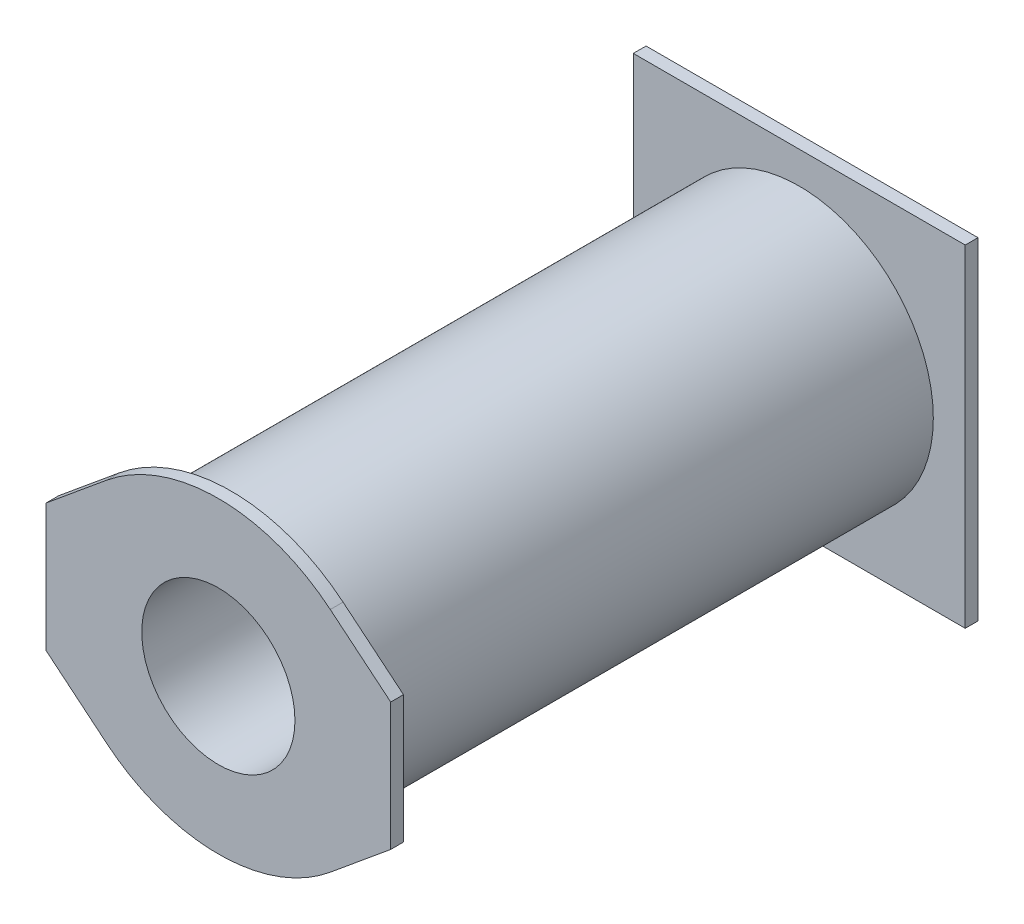
ISO-10303-21;
HEADER;
FILE_DESCRIPTION(('STEP AP214'),'2;1');
FILE_NAME('part.step','',(''),(''),'','','');
FILE_SCHEMA(('AUTOMOTIVE_DESIGN { 1 0 10303 214 1 1 1 1 }'));
ENDSEC;
DATA;
#1=APPLICATION_CONTEXT('core data for automotive mechanical design processes');
#2=APPLICATION_PROTOCOL_DEFINITION('international standard','automotive_design',2000,#1);
#3=PRODUCT_CONTEXT('',#1,'mechanical');
#4=PRODUCT('Part','Part','',(#3));
#5=PRODUCT_RELATED_PRODUCT_CATEGORY('part','',(#4));
#6=PRODUCT_DEFINITION_FORMATION('','',#4);
#7=PRODUCT_DEFINITION_CONTEXT('part definition',#1,'design');
#8=PRODUCT_DEFINITION('design','',#6,#7);
#9=PRODUCT_DEFINITION_SHAPE('','',#8);
#10=(LENGTH_UNIT() NAMED_UNIT(*) SI_UNIT(.MILLI.,.METRE.));
#11=(NAMED_UNIT(*) PLANE_ANGLE_UNIT() SI_UNIT($,.RADIAN.));
#12=(NAMED_UNIT(*) SI_UNIT($,.STERADIAN.) SOLID_ANGLE_UNIT());
#13=UNCERTAINTY_MEASURE_WITH_UNIT(LENGTH_MEASURE(1.E-05),#10,'distance_accuracy_value','');
#14=(GEOMETRIC_REPRESENTATION_CONTEXT(3) GLOBAL_UNCERTAINTY_ASSIGNED_CONTEXT((#13)) GLOBAL_UNIT_ASSIGNED_CONTEXT((#10,
#11,#12)) REPRESENTATION_CONTEXT('',''));
#15=CARTESIAN_POINT('',(0.,0.,0.));
#16=DIRECTION('',(0.,0.,1.));
#17=DIRECTION('',(1.,0.,0.));
#18=AXIS2_PLACEMENT_3D('',#15,#16,#17);
#19=CARTESIAN_POINT('',(-13.,-13.,1.));
#20=DIRECTION('',(1.,0.,0.));
#21=DIRECTION('',(0.,1.,0.));
#22=AXIS2_PLACEMENT_3D('',#19,#20,#21);
#23=PLANE('',#22);
#24=DIRECTION('',(0.,-1.,0.));
#25=VECTOR('',#24,1.);
#26=CARTESIAN_POINT('',(-13.,-13.,0.));
#27=LINE('',#26,#25);
#28=CARTESIAN_POINT('',(-13.,13.,0.));
#29=VERTEX_POINT('',#28);
#30=CARTESIAN_POINT('',(-13.,-13.,0.));
#31=VERTEX_POINT('',#30);
#32=EDGE_CURVE('E164',#29,#31,#27,.T.);
#33=ORIENTED_EDGE('',*,*,#32,.T.);
#34=DIRECTION('',(0.,0.,-1.));
#35=VECTOR('',#34,1.);
#36=CARTESIAN_POINT('',(-13.,-13.,1.));
#37=LINE('',#36,#35);
#38=CARTESIAN_POINT('',(-13.,-13.,1.));
#39=VERTEX_POINT('',#38);
#40=EDGE_CURVE('E38',#39,#31,#37,.T.);
#41=ORIENTED_EDGE('',*,*,#40,.F.);
#42=DIRECTION('',(0.,-1.,0.));
#43=VECTOR('',#42,1.);
#44=CARTESIAN_POINT('',(-13.,-13.,1.));
#45=LINE('',#44,#43);
#46=CARTESIAN_POINT('',(-13.,13.,1.));
#47=VERTEX_POINT('',#46);
#48=EDGE_CURVE('E170',#47,#39,#45,.T.);
#49=ORIENTED_EDGE('',*,*,#48,.F.);
#50=DIRECTION('',(0.,0.,-1.));
#51=VECTOR('',#50,1.);
#52=CARTESIAN_POINT('',(-13.,13.,1.));
#53=LINE('',#52,#51);
#54=EDGE_CURVE('E176',#47,#29,#53,.T.);
#55=ORIENTED_EDGE('',*,*,#54,.T.);
#56=EDGE_LOOP('',(#33,#41,#49,#55));
#57=FACE_BOUND('',#56,.T.);
#58=ADVANCED_FACE('F35',(#57),#23,.F.);
#59=CARTESIAN_POINT('',(13.,-13.,1.));
#60=DIRECTION('',(0.,1.,0.));
#61=DIRECTION('',(-1.,0.,0.));
#62=AXIS2_PLACEMENT_3D('',#59,#60,#61);
#63=PLANE('',#62);
#64=DIRECTION('',(1.,0.,0.));
#65=VECTOR('',#64,1.);
#66=CARTESIAN_POINT('',(13.,-13.,0.));
#67=LINE('',#66,#65);
#68=CARTESIAN_POINT('',(13.,-13.,0.));
#69=VERTEX_POINT('',#68);
#70=EDGE_CURVE('E179',#31,#69,#67,.T.);
#71=ORIENTED_EDGE('',*,*,#70,.T.);
#72=DIRECTION('',(0.,0.,-1.));
#73=VECTOR('',#72,1.);
#74=CARTESIAN_POINT('',(13.,-13.,1.));
#75=LINE('',#74,#73);
#76=CARTESIAN_POINT('',(13.,-13.,1.));
#77=VERTEX_POINT('',#76);
#78=EDGE_CURVE('E185',#77,#69,#75,.T.);
#79=ORIENTED_EDGE('',*,*,#78,.F.);
#80=DIRECTION('',(1.,0.,0.));
#81=VECTOR('',#80,1.);
#82=CARTESIAN_POINT('',(13.,-13.,1.));
#83=LINE('',#82,#81);
#84=EDGE_CURVE('E84',#39,#77,#83,.T.);
#85=ORIENTED_EDGE('',*,*,#84,.F.);
#86=ORIENTED_EDGE('',*,*,#40,.T.);
#87=EDGE_LOOP('',(#71,#79,#85,#86));
#88=FACE_BOUND('',#87,.T.);
#89=ADVANCED_FACE('F188',(#88),#63,.F.);
#90=CARTESIAN_POINT('',(13.,-13.,1.));
#91=DIRECTION('',(-1.,0.,0.));
#92=DIRECTION('',(0.,0.,1.));
#93=AXIS2_PLACEMENT_3D('',#90,#91,#92);
#94=PLANE('',#93);
#95=DIRECTION('',(0.,1.,0.));
#96=VECTOR('',#95,1.);
#97=CARTESIAN_POINT('',(13.,-13.,0.));
#98=LINE('',#97,#96);
#99=CARTESIAN_POINT('',(13.,13.,0.));
#100=VERTEX_POINT('',#99);
#101=EDGE_CURVE('E70',#69,#100,#98,.T.);
#102=ORIENTED_EDGE('',*,*,#101,.T.);
#103=DIRECTION('',(0.,0.,-1.));
#104=VECTOR('',#103,1.);
#105=CARTESIAN_POINT('',(13.,13.,1.));
#106=LINE('',#105,#104);
#107=CARTESIAN_POINT('',(13.,13.,1.));
#108=VERTEX_POINT('',#107);
#109=EDGE_CURVE('E184',#108,#100,#106,.T.);
#110=ORIENTED_EDGE('',*,*,#109,.F.);
#111=DIRECTION('',(0.,1.,0.));
#112=VECTOR('',#111,1.);
#113=CARTESIAN_POINT('',(13.,-13.,1.));
#114=LINE('',#113,#112);
#115=EDGE_CURVE('E173',#77,#108,#114,.T.);
#116=ORIENTED_EDGE('',*,*,#115,.F.);
#117=ORIENTED_EDGE('',*,*,#78,.T.);
#118=EDGE_LOOP('',(#102,#110,#116,#117));
#119=FACE_BOUND('',#118,.T.);
#120=ADVANCED_FACE('F214',(#119),#94,.F.);
#121=CARTESIAN_POINT('',(13.,13.,1.));
#122=DIRECTION('',(0.,-1.,0.));
#123=DIRECTION('',(0.,0.,-1.));
#124=AXIS2_PLACEMENT_3D('',#121,#122,#123);
#125=PLANE('',#124);
#126=DIRECTION('',(-1.,0.,0.));
#127=VECTOR('',#126,1.);
#128=CARTESIAN_POINT('',(13.,13.,0.));
#129=LINE('',#128,#127);
#130=EDGE_CURVE('E76',#100,#29,#129,.T.);
#131=ORIENTED_EDGE('',*,*,#130,.T.);
#132=ORIENTED_EDGE('',*,*,#54,.F.);
#133=DIRECTION('',(-1.,0.,0.));
#134=VECTOR('',#133,1.);
#135=CARTESIAN_POINT('',(13.,13.,1.));
#136=LINE('',#135,#134);
#137=EDGE_CURVE('E52',#108,#47,#136,.T.);
#138=ORIENTED_EDGE('',*,*,#137,.F.);
#139=ORIENTED_EDGE('',*,*,#109,.T.);
#140=EDGE_LOOP('',(#131,#132,#138,#139));
#141=FACE_BOUND('',#140,.T.);
#142=ADVANCED_FACE('F205',(#141),#125,.F.);
#143=CARTESIAN_POINT('',(0.,0.,1.));
#144=DIRECTION('',(0.,0.,1.));
#145=DIRECTION('',(1.,0.,0.));
#146=AXIS2_PLACEMENT_3D('',#143,#144,#145);
#147=PLANE('',#146);
#148=CARTESIAN_POINT('',(0.,0.,1.));
#149=DIRECTION('',(0.,0.,1.));
#150=DIRECTION('',(1.,0.,0.));
#151=AXIS2_PLACEMENT_3D('',#148,#149,#150);
#152=CIRCLE('',#151,10.5);
#153=CARTESIAN_POINT('',(10.5,0.,1.));
#154=VERTEX_POINT('',#153);
#155=EDGE_CURVE('E11',#154,#154,#152,.T.);
#156=ORIENTED_EDGE('',*,*,#155,.F.);
#157=EDGE_LOOP('',(#156));
#158=FACE_BOUND('',#157,.T.);
#159=ORIENTED_EDGE('',*,*,#48,.T.);
#160=ORIENTED_EDGE('',*,*,#84,.T.);
#161=ORIENTED_EDGE('',*,*,#115,.T.);
#162=ORIENTED_EDGE('',*,*,#137,.T.);
#163=EDGE_LOOP('',(#159,#160,#161,#162));
#164=FACE_BOUND('',#163,.T.);
#165=ADVANCED_FACE('F196',(#158,#164),#147,.T.);
#166=CARTESIAN_POINT('',(0.,0.,0.));
#167=DIRECTION('',(0.,0.,1.));
#168=DIRECTION('',(1.,0.,0.));
#169=AXIS2_PLACEMENT_3D('',#166,#167,#168);
#170=PLANE('',#169);
#171=CARTESIAN_POINT('',(0.,0.,0.));
#172=DIRECTION('',(0.,0.,1.));
#173=DIRECTION('',(1.,0.,0.));
#174=AXIS2_PLACEMENT_3D('',#171,#172,#173);
#175=CIRCLE('',#174,6.);
#176=CARTESIAN_POINT('',(6.,0.,0.));
#177=VERTEX_POINT('',#176);
#178=EDGE_CURVE('E351',#177,#177,#175,.T.);
#179=ORIENTED_EDGE('',*,*,#178,.T.);
#180=EDGE_LOOP('',(#179));
#181=FACE_BOUND('',#180,.T.);
#182=ORIENTED_EDGE('',*,*,#32,.F.);
#183=ORIENTED_EDGE('',*,*,#130,.F.);
#184=ORIENTED_EDGE('',*,*,#101,.F.);
#185=ORIENTED_EDGE('',*,*,#70,.F.);
#186=EDGE_LOOP('',(#182,#183,#184,#185));
#187=FACE_BOUND('',#186,.T.);
#188=ADVANCED_FACE('F193',(#181,#187),#170,.F.);
#189=CARTESIAN_POINT('',(0.,0.,45.5));
#190=DIRECTION('',(0.,0.,-1.));
#191=DIRECTION('',(-1.,0.,0.));
#192=AXIS2_PLACEMENT_3D('',#189,#190,#191);
#193=CYLINDRICAL_SURFACE('',#192,10.5);
#194=CARTESIAN_POINT('',(0.,0.,45.5));
#195=DIRECTION('',(0.,0.,1.));
#196=DIRECTION('',(1.,0.,0.));
#197=AXIS2_PLACEMENT_3D('',#194,#195,#196);
#198=CIRCLE('',#197,10.5);
#199=CARTESIAN_POINT('',(10.5,0.,45.5));
#200=VERTEX_POINT('',#199);
#201=EDGE_CURVE('E161',#200,#200,#198,.T.);
#202=ORIENTED_EDGE('',*,*,#201,.F.);
#203=EDGE_LOOP('',(#202));
#204=FACE_BOUND('',#203,.T.);
#205=ORIENTED_EDGE('',*,*,#155,.T.);
#206=EDGE_LOOP('',(#205));
#207=FACE_BOUND('',#206,.T.);
#208=ADVANCED_FACE('F195',(#204,#207),#193,.T.);
#209=CARTESIAN_POINT('',(13.5,0.,46.5));
#210=DIRECTION('',(-1.,0.,0.));
#211=DIRECTION('',(0.,0.,1.));
#212=AXIS2_PLACEMENT_3D('',#209,#210,#211);
#213=PLANE('',#212);
#214=DIRECTION('',(0.,1.,0.));
#215=VECTOR('',#214,1.);
#216=CARTESIAN_POINT('',(13.5,0.,45.5));
#217=LINE('',#216,#215);
#218=CARTESIAN_POINT('',(13.5,-5.,45.5));
#219=VERTEX_POINT('',#218);
#220=CARTESIAN_POINT('',(13.5,5.,45.5));
#221=VERTEX_POINT('',#220);
#222=EDGE_CURVE('E160',#219,#221,#217,.T.);
#223=ORIENTED_EDGE('',*,*,#222,.T.);
#224=DIRECTION('',(0.,0.,-1.));
#225=VECTOR('',#224,1.);
#226=CARTESIAN_POINT('',(13.5,5.,46.5));
#227=LINE('',#226,#225);
#228=CARTESIAN_POINT('',(13.5,5.,46.5));
#229=VERTEX_POINT('',#228);
#230=EDGE_CURVE('E140',#229,#221,#227,.T.);
#231=ORIENTED_EDGE('',*,*,#230,.F.);
#232=DIRECTION('',(0.,1.,0.));
#233=VECTOR('',#232,1.);
#234=CARTESIAN_POINT('',(13.5,0.,46.5));
#235=LINE('',#234,#233);
#236=CARTESIAN_POINT('',(13.5,-5.,46.5));
#237=VERTEX_POINT('',#236);
#238=EDGE_CURVE('E147',#237,#229,#235,.T.);
#239=ORIENTED_EDGE('',*,*,#238,.F.);
#240=DIRECTION('',(0.,0.,-1.));
#241=VECTOR('',#240,1.);
#242=CARTESIAN_POINT('',(13.5,-5.,46.5));
#243=LINE('',#242,#241);
#244=EDGE_CURVE('E371',#237,#219,#243,.T.);
#245=ORIENTED_EDGE('',*,*,#244,.T.);
#246=EDGE_LOOP('',(#223,#231,#239,#245));
#247=FACE_BOUND('',#246,.T.);
#248=ADVANCED_FACE('F158',(#247),#213,.F.);
#249=CARTESIAN_POINT('',(7.93131539343272,9.60049251399077,46.5));
#250=DIRECTION('',(-0.636904059036233,-0.770943071557927,0.));
#251=DIRECTION('',(0.770943071557927,-0.636904059036233,0.));
#252=AXIS2_PLACEMENT_3D('',#249,#250,#251);
#253=PLANE('',#252);
#254=DIRECTION('',(-0.770943071557927,0.636904059036233,0.));
#255=VECTOR('',#254,1.);
#256=CARTESIAN_POINT('',(7.93131539343272,9.60049251399077,45.5));
#257=LINE('',#256,#255);
#258=CARTESIAN_POINT('',(8.76691939574344,8.91016971266751,45.5));
#259=VERTEX_POINT('',#258);
#260=EDGE_CURVE('E373',#221,#259,#257,.T.);
#261=ORIENTED_EDGE('',*,*,#260,.T.);
#262=DIRECTION('',(0.,0.,-1.));
#263=VECTOR('',#262,1.);
#264=CARTESIAN_POINT('',(8.76691939574344,8.91016971266751,46.5));
#265=LINE('',#264,#263);
#266=CARTESIAN_POINT('',(8.76691939574344,8.91016971266751,46.5));
#267=VERTEX_POINT('',#266);
#268=EDGE_CURVE('E142',#267,#259,#265,.T.);
#269=ORIENTED_EDGE('',*,*,#268,.F.);
#270=DIRECTION('',(-0.770943071557927,0.636904059036233,0.));
#271=VECTOR('',#270,1.);
#272=CARTESIAN_POINT('',(7.93131539343272,9.60049251399077,46.5));
#273=LINE('',#272,#271);
#274=EDGE_CURVE('E135',#229,#267,#273,.T.);
#275=ORIENTED_EDGE('',*,*,#274,.F.);
#276=ORIENTED_EDGE('',*,*,#230,.T.);
#277=EDGE_LOOP('',(#261,#269,#275,#276));
#278=FACE_BOUND('',#277,.T.);
#279=ADVANCED_FACE('F138',(#278),#253,.F.);
#280=CARTESIAN_POINT('',(0.,-1.70178301579001,46.5));
#281=DIRECTION('',(0.,0.,-1.));
#282=DIRECTION('',(-1.,0.,0.));
#283=AXIS2_PLACEMENT_3D('',#280,#281,#282);
#284=CYLINDRICAL_SURFACE('',#283,13.764897980097);
#285=CARTESIAN_POINT('',(0.,-1.70178301579001,45.5));
#286=DIRECTION('',(0.,0.,1.));
#287=DIRECTION('',(1.,0.,0.));
#288=AXIS2_PLACEMENT_3D('',#285,#286,#287);
#289=CIRCLE('',#288,13.764897980097);
#290=CARTESIAN_POINT('',(-8.76691939574344,8.91016971266751,45.5));
#291=VERTEX_POINT('',#290);
#292=EDGE_CURVE('E375',#291,#259,#289,.F.);
#293=ORIENTED_EDGE('',*,*,#292,.F.);
#294=DIRECTION('',(0.,0.,-1.));
#295=VECTOR('',#294,1.);
#296=CARTESIAN_POINT('',(-8.76691939574344,8.91016971266751,46.5));
#297=LINE('',#296,#295);
#298=CARTESIAN_POINT('',(-8.76691939574344,8.91016971266751,46.5));
#299=VERTEX_POINT('',#298);
#300=EDGE_CURVE('E166',#299,#291,#297,.T.);
#301=ORIENTED_EDGE('',*,*,#300,.F.);
#302=CARTESIAN_POINT('',(0.,-1.70178301579001,46.5));
#303=DIRECTION('',(0.,0.,1.));
#304=DIRECTION('',(1.,0.,0.));
#305=AXIS2_PLACEMENT_3D('',#302,#303,#304);
#306=CIRCLE('',#305,13.764897980097);
#307=EDGE_CURVE('E146',#299,#267,#306,.F.);
#308=ORIENTED_EDGE('',*,*,#307,.T.);
#309=ORIENTED_EDGE('',*,*,#268,.T.);
#310=EDGE_LOOP('',(#293,#301,#308,#309));
#311=FACE_BOUND('',#310,.T.);
#312=ADVANCED_FACE('F252',(#311),#284,.T.);
#313=CARTESIAN_POINT('',(-7.93131539343272,9.60049251399077,46.5));
#314=DIRECTION('',(-0.636904059036233,0.770943071557927,0.));
#315=DIRECTION('',(-0.770943071557927,-0.636904059036233,0.));
#316=AXIS2_PLACEMENT_3D('',#313,#314,#315);
#317=PLANE('',#316);
#318=DIRECTION('',(0.770943071557927,0.636904059036233,0.));
#319=VECTOR('',#318,1.);
#320=CARTESIAN_POINT('',(-7.93131539343272,9.60049251399077,45.5));
#321=LINE('',#320,#319);
#322=CARTESIAN_POINT('',(-13.5,5.,45.5));
#323=VERTEX_POINT('',#322);
#324=EDGE_CURVE('E378',#323,#291,#321,.T.);
#325=ORIENTED_EDGE('',*,*,#324,.F.);
#326=DIRECTION('',(0.,0.,-1.));
#327=VECTOR('',#326,1.);
#328=CARTESIAN_POINT('',(-13.5,5.,46.5));
#329=LINE('',#328,#327);
#330=CARTESIAN_POINT('',(-13.5,5.,46.5));
#331=VERTEX_POINT('',#330);
#332=EDGE_CURVE('E399',#331,#323,#329,.T.);
#333=ORIENTED_EDGE('',*,*,#332,.F.);
#334=DIRECTION('',(0.770943071557927,0.636904059036233,0.));
#335=VECTOR('',#334,1.);
#336=CARTESIAN_POINT('',(-7.93131539343272,9.60049251399077,46.5));
#337=LINE('',#336,#335);
#338=EDGE_CURVE('E359',#331,#299,#337,.T.);
#339=ORIENTED_EDGE('',*,*,#338,.T.);
#340=ORIENTED_EDGE('',*,*,#300,.T.);
#341=EDGE_LOOP('',(#325,#333,#339,#340));
#342=FACE_BOUND('',#341,.T.);
#343=ADVANCED_FACE('F261',(#342),#317,.T.);
#344=CARTESIAN_POINT('',(-13.5,0.,46.5));
#345=DIRECTION('',(-1.,0.,0.));
#346=DIRECTION('',(0.,0.,1.));
#347=AXIS2_PLACEMENT_3D('',#344,#345,#346);
#348=PLANE('',#347);
#349=DIRECTION('',(0.,1.,0.));
#350=VECTOR('',#349,1.);
#351=CARTESIAN_POINT('',(-13.5,0.,45.5));
#352=LINE('',#351,#350);
#353=CARTESIAN_POINT('',(-13.5,-5.,45.5));
#354=VERTEX_POINT('',#353);
#355=EDGE_CURVE('E381',#354,#323,#352,.T.);
#356=ORIENTED_EDGE('',*,*,#355,.F.);
#357=DIRECTION('',(0.,0.,-1.));
#358=VECTOR('',#357,1.);
#359=CARTESIAN_POINT('',(-13.5,-5.,46.5));
#360=LINE('',#359,#358);
#361=CARTESIAN_POINT('',(-13.5,-5.,46.5));
#362=VERTEX_POINT('',#361);
#363=EDGE_CURVE('E397',#362,#354,#360,.T.);
#364=ORIENTED_EDGE('',*,*,#363,.F.);
#365=DIRECTION('',(0.,1.,0.));
#366=VECTOR('',#365,1.);
#367=CARTESIAN_POINT('',(-13.5,0.,46.5));
#368=LINE('',#367,#366);
#369=EDGE_CURVE('E362',#362,#331,#368,.T.);
#370=ORIENTED_EDGE('',*,*,#369,.T.);
#371=ORIENTED_EDGE('',*,*,#332,.T.);
#372=EDGE_LOOP('',(#356,#364,#370,#371));
#373=FACE_BOUND('',#372,.T.);
#374=ADVANCED_FACE('F271',(#373),#348,.T.);
#375=CARTESIAN_POINT('',(-7.93131539343272,-9.60049251399077,46.5));
#376=DIRECTION('',(0.636904059036233,0.770943071557927,0.));
#377=DIRECTION('',(-0.770943071557927,0.636904059036233,0.));
#378=AXIS2_PLACEMENT_3D('',#375,#376,#377);
#379=PLANE('',#378);
#380=DIRECTION('',(0.770943071557927,-0.636904059036233,0.));
#381=VECTOR('',#380,1.);
#382=CARTESIAN_POINT('',(-7.93131539343272,-9.60049251399077,45.5));
#383=LINE('',#382,#381);
#384=CARTESIAN_POINT('',(-8.76691939574344,-8.91016971266751,45.5));
#385=VERTEX_POINT('',#384);
#386=EDGE_CURVE('E384',#354,#385,#383,.T.);
#387=ORIENTED_EDGE('',*,*,#386,.T.);
#388=DIRECTION('',(0.,0.,-1.));
#389=VECTOR('',#388,1.);
#390=CARTESIAN_POINT('',(-8.76691939574344,-8.91016971266751,46.5));
#391=LINE('',#390,#389);
#392=CARTESIAN_POINT('',(-8.76691939574344,-8.91016971266751,46.5));
#393=VERTEX_POINT('',#392);
#394=EDGE_CURVE('E395',#393,#385,#391,.T.);
#395=ORIENTED_EDGE('',*,*,#394,.F.);
#396=DIRECTION('',(0.770943071557927,-0.636904059036233,0.));
#397=VECTOR('',#396,1.);
#398=CARTESIAN_POINT('',(-7.93131539343272,-9.60049251399077,46.5));
#399=LINE('',#398,#397);
#400=EDGE_CURVE('E365',#362,#393,#399,.T.);
#401=ORIENTED_EDGE('',*,*,#400,.F.);
#402=ORIENTED_EDGE('',*,*,#363,.T.);
#403=EDGE_LOOP('',(#387,#395,#401,#402));
#404=FACE_BOUND('',#403,.T.);
#405=ADVANCED_FACE('F281',(#404),#379,.F.);
#406=CARTESIAN_POINT('',(0.,1.70178301578999,46.5));
#407=DIRECTION('',(0.,0.,-1.));
#408=DIRECTION('',(-1.,0.,0.));
#409=AXIS2_PLACEMENT_3D('',#406,#407,#408);
#410=CYLINDRICAL_SURFACE('',#409,13.764897980097);
#411=CARTESIAN_POINT('',(0.,1.70178301578999,45.5));
#412=DIRECTION('',(0.,0.,1.));
#413=DIRECTION('',(1.,0.,0.));
#414=AXIS2_PLACEMENT_3D('',#411,#412,#413);
#415=CIRCLE('',#414,13.764897980097);
#416=CARTESIAN_POINT('',(8.76691939574344,-8.91016971266751,45.5));
#417=VERTEX_POINT('',#416);
#418=EDGE_CURVE('E387',#417,#385,#415,.F.);
#419=ORIENTED_EDGE('',*,*,#418,.F.);
#420=DIRECTION('',(0.,0.,-1.));
#421=VECTOR('',#420,1.);
#422=CARTESIAN_POINT('',(8.76691939574344,-8.91016971266751,46.5));
#423=LINE('',#422,#421);
#424=CARTESIAN_POINT('',(8.76691939574344,-8.91016971266751,46.5));
#425=VERTEX_POINT('',#424);
#426=EDGE_CURVE('E393',#425,#417,#423,.T.);
#427=ORIENTED_EDGE('',*,*,#426,.F.);
#428=CARTESIAN_POINT('',(0.,1.70178301578999,46.5));
#429=DIRECTION('',(0.,0.,1.));
#430=DIRECTION('',(1.,0.,0.));
#431=AXIS2_PLACEMENT_3D('',#428,#429,#430);
#432=CIRCLE('',#431,13.764897980097);
#433=EDGE_CURVE('E367',#425,#393,#432,.F.);
#434=ORIENTED_EDGE('',*,*,#433,.T.);
#435=ORIENTED_EDGE('',*,*,#394,.T.);
#436=EDGE_LOOP('',(#419,#427,#434,#435));
#437=FACE_BOUND('',#436,.T.);
#438=ADVANCED_FACE('F291',(#437),#410,.T.);
#439=CARTESIAN_POINT('',(7.93131539343272,-9.60049251399077,46.5));
#440=DIRECTION('',(0.636904059036233,-0.770943071557927,0.));
#441=DIRECTION('',(0.770943071557927,0.636904059036233,0.));
#442=AXIS2_PLACEMENT_3D('',#439,#440,#441);
#443=PLANE('',#442);
#444=DIRECTION('',(-0.770943071557927,-0.636904059036233,0.));
#445=VECTOR('',#444,1.);
#446=CARTESIAN_POINT('',(7.93131539343272,-9.60049251399077,45.5));
#447=LINE('',#446,#445);
#448=EDGE_CURVE('E156',#219,#417,#447,.T.);
#449=ORIENTED_EDGE('',*,*,#448,.F.);
#450=ORIENTED_EDGE('',*,*,#244,.F.);
#451=DIRECTION('',(-0.770943071557927,-0.636904059036233,0.));
#452=VECTOR('',#451,1.);
#453=CARTESIAN_POINT('',(7.93131539343272,-9.60049251399077,46.5));
#454=LINE('',#453,#452);
#455=EDGE_CURVE('E154',#237,#425,#454,.T.);
#456=ORIENTED_EDGE('',*,*,#455,.T.);
#457=ORIENTED_EDGE('',*,*,#426,.T.);
#458=EDGE_LOOP('',(#449,#450,#456,#457));
#459=FACE_BOUND('',#458,.T.);
#460=ADVANCED_FACE('F301',(#459),#443,.T.);
#461=CARTESIAN_POINT('',(0.,0.,46.5));
#462=DIRECTION('',(0.,0.,1.));
#463=DIRECTION('',(1.,0.,0.));
#464=AXIS2_PLACEMENT_3D('',#461,#462,#463);
#465=PLANE('',#464);
#466=CARTESIAN_POINT('',(0.,0.,46.5));
#467=DIRECTION('',(0.,0.,1.));
#468=DIRECTION('',(1.,0.,0.));
#469=AXIS2_PLACEMENT_3D('',#466,#467,#468);
#470=CIRCLE('',#469,6.);
#471=CARTESIAN_POINT('',(6.,0.,46.5));
#472=VERTEX_POINT('',#471);
#473=EDGE_CURVE('E354',#472,#472,#470,.T.);
#474=ORIENTED_EDGE('',*,*,#473,.F.);
#475=EDGE_LOOP('',(#474));
#476=FACE_BOUND('',#475,.T.);
#477=ORIENTED_EDGE('',*,*,#238,.T.);
#478=ORIENTED_EDGE('',*,*,#274,.T.);
#479=ORIENTED_EDGE('',*,*,#307,.F.);
#480=ORIENTED_EDGE('',*,*,#338,.F.);
#481=ORIENTED_EDGE('',*,*,#369,.F.);
#482=ORIENTED_EDGE('',*,*,#400,.T.);
#483=ORIENTED_EDGE('',*,*,#433,.F.);
#484=ORIENTED_EDGE('',*,*,#455,.F.);
#485=EDGE_LOOP('',(#477,#478,#479,#480,#481,#482,#483,#484));
#486=FACE_BOUND('',#485,.T.);
#487=ADVANCED_FACE('F151',(#476,#486),#465,.T.);
#488=CARTESIAN_POINT('',(0.,0.,45.5));
#489=DIRECTION('',(0.,0.,1.));
#490=DIRECTION('',(1.,0.,0.));
#491=AXIS2_PLACEMENT_3D('',#488,#489,#490);
#492=PLANE('',#491);
#493=ORIENTED_EDGE('',*,*,#201,.T.);
#494=EDGE_LOOP('',(#493));
#495=FACE_BOUND('',#494,.T.);
#496=ORIENTED_EDGE('',*,*,#222,.F.);
#497=ORIENTED_EDGE('',*,*,#448,.T.);
#498=ORIENTED_EDGE('',*,*,#418,.T.);
#499=ORIENTED_EDGE('',*,*,#386,.F.);
#500=ORIENTED_EDGE('',*,*,#355,.T.);
#501=ORIENTED_EDGE('',*,*,#324,.T.);
#502=ORIENTED_EDGE('',*,*,#292,.T.);
#503=ORIENTED_EDGE('',*,*,#260,.F.);
#504=EDGE_LOOP('',(#496,#497,#498,#499,#500,#501,#502,#503));
#505=FACE_BOUND('',#504,.T.);
#506=ADVANCED_FACE('F318',(#495,#505),#492,.F.);
#507=CARTESIAN_POINT('',(0.,0.,0.));
#508=DIRECTION('',(0.,0.,1.));
#509=DIRECTION('',(1.,0.,0.));
#510=AXIS2_PLACEMENT_3D('',#507,#508,#509);
#511=CYLINDRICAL_SURFACE('',#510,6.);
#512=CARTESIAN_POINT('',(6.,0.,0.));
#513=CARTESIAN_POINT('',(6.,0.,0.484374999999999));
#514=CARTESIAN_POINT('',(6.,0.,0.96875));
#515=CARTESIAN_POINT('',(6.,0.,1.9375));
#516=CARTESIAN_POINT('',(6.,0.,2.421875));
#517=CARTESIAN_POINT('',(6.,0.,3.390625));
#518=CARTESIAN_POINT('',(6.,0.,3.875));
#519=CARTESIAN_POINT('',(6.,0.,4.84375));
#520=CARTESIAN_POINT('',(6.,0.,5.328125));
#521=CARTESIAN_POINT('',(6.,0.,6.296875));
#522=CARTESIAN_POINT('',(6.,0.,6.78125));
#523=CARTESIAN_POINT('',(6.,0.,7.75));
#524=CARTESIAN_POINT('',(6.,0.,8.234375));
#525=CARTESIAN_POINT('',(6.,0.,9.203125));
#526=CARTESIAN_POINT('',(6.,0.,9.6875));
#527=CARTESIAN_POINT('',(6.,0.,10.65625));
#528=CARTESIAN_POINT('',(6.,0.,11.140625));
#529=CARTESIAN_POINT('',(6.,0.,12.109375));
#530=CARTESIAN_POINT('',(6.,0.,12.59375));
#531=CARTESIAN_POINT('',(6.,0.,13.5625));
#532=CARTESIAN_POINT('',(6.,0.,14.046875));
#533=CARTESIAN_POINT('',(6.,0.,15.015625));
#534=CARTESIAN_POINT('',(6.,0.,15.5));
#535=CARTESIAN_POINT('',(6.,0.,16.46875));
#536=CARTESIAN_POINT('',(6.,0.,16.953125));
#537=CARTESIAN_POINT('',(6.,0.,17.921875));
#538=CARTESIAN_POINT('',(6.,0.,18.40625));
#539=CARTESIAN_POINT('',(6.,0.,19.375));
#540=CARTESIAN_POINT('',(6.,0.,19.859375));
#541=CARTESIAN_POINT('',(6.,0.,20.828125));
#542=CARTESIAN_POINT('',(6.,0.,21.3125));
#543=CARTESIAN_POINT('',(6.,0.,22.28125));
#544=CARTESIAN_POINT('',(6.,0.,22.765625));
#545=CARTESIAN_POINT('',(6.,0.,23.734375));
#546=CARTESIAN_POINT('',(6.,0.,24.21875));
#547=CARTESIAN_POINT('',(6.,0.,25.1875));
#548=CARTESIAN_POINT('',(6.,0.,25.671875));
#549=CARTESIAN_POINT('',(6.,0.,26.640625));
#550=CARTESIAN_POINT('',(6.,0.,27.125));
#551=CARTESIAN_POINT('',(6.,0.,28.09375));
#552=CARTESIAN_POINT('',(6.,0.,28.578125));
#553=CARTESIAN_POINT('',(6.,0.,29.546875));
#554=CARTESIAN_POINT('',(6.,0.,30.03125));
#555=CARTESIAN_POINT('',(6.,0.,31.));
#556=CARTESIAN_POINT('',(6.,0.,31.484375));
#557=CARTESIAN_POINT('',(6.,0.,32.453125));
#558=CARTESIAN_POINT('',(6.,0.,32.9375));
#559=CARTESIAN_POINT('',(6.,0.,33.90625));
#560=CARTESIAN_POINT('',(6.,0.,34.390625));
#561=CARTESIAN_POINT('',(6.,0.,35.359375));
#562=CARTESIAN_POINT('',(6.,0.,35.84375));
#563=CARTESIAN_POINT('',(6.,0.,36.8125));
#564=CARTESIAN_POINT('',(6.,0.,37.296875));
#565=CARTESIAN_POINT('',(6.,0.,38.265625));
#566=CARTESIAN_POINT('',(6.,0.,38.75));
#567=CARTESIAN_POINT('',(6.,0.,39.71875));
#568=CARTESIAN_POINT('',(6.,0.,40.203125));
#569=CARTESIAN_POINT('',(6.,0.,41.171875));
#570=CARTESIAN_POINT('',(6.,0.,41.65625));
#571=CARTESIAN_POINT('',(6.,0.,42.625));
#572=CARTESIAN_POINT('',(6.,0.,43.109375));
#573=CARTESIAN_POINT('',(6.,0.,44.078125));
#574=CARTESIAN_POINT('',(6.,0.,44.5625));
#575=CARTESIAN_POINT('',(6.,0.,45.53125));
#576=CARTESIAN_POINT('',(6.,0.,46.015625));
#577=CARTESIAN_POINT('',(6.,0.,46.5));
#578=B_SPLINE_CURVE_WITH_KNOTS('',3,(#512,#513,#514,#515,#516,#517,#518,#519,#520,#521,#522,
#523,#524,#525,#526,#527,#528,#529,#530,#531,#532,#533,#534,#535,#536,#537,#538,#539,#540,#541,
#542,#543,#544,#545,#546,#547,#548,#549,#550,#551,#552,#553,#554,#555,#556,#557,#558,#559,#560,
#561,#562,#563,#564,#565,#566,#567,#568,#569,#570,#571,#572,#573,#574,#575,#576,#577),
.UNSPECIFIED.,.F.,.F.,(4,2,2,2,2,2,2,2,2,2,2,2,2,2,2,2,2,2,2,2,2,2,2,2,2,2,2,2,2,2,2,2,4),(0.,
1.453125,2.90625,4.359375,5.8125,7.265625,8.71875,10.171875,11.625,13.078125,14.53125,15.984375,
17.4375,18.890625,20.34375,21.796875,23.25,24.703125,26.15625,27.609375,29.0625,30.515625,
31.96875,33.421875,34.875,36.328125,37.78125,39.234375,40.6875,42.140625,43.59375,45.046875,
46.5),.UNSPECIFIED.);
#579=EDGE_CURVE('BSEAM322',#177,#472,#578,.T.);
#580=ORIENTED_EDGE('',*,*,#178,.F.);
#581=ORIENTED_EDGE('',*,*,#473,.T.);
#582=ORIENTED_EDGE('',*,*,#579,.T.);
#583=ORIENTED_EDGE('',*,*,#579,.F.);
#584=EDGE_LOOP('',(#580,#582,#581,#583));
#585=FACE_BOUND('',#584,.T.);
#586=ADVANCED_FACE('F322',(#585),#511,.F.);
#587=CLOSED_SHELL('',(#58,#89,#120,#142,#165,#188,#208,#248,#279,#312,#343,#374,#405,#438,#460,
#487,#506,#586));
#588=MANIFOLD_SOLID_BREP('B2',#587);
#589=ADVANCED_BREP_SHAPE_REPRESENTATION('',(#18,#588),#14);
#590=SHAPE_DEFINITION_REPRESENTATION(#9,#589);
ENDSEC;
END-ISO-10303-21;
